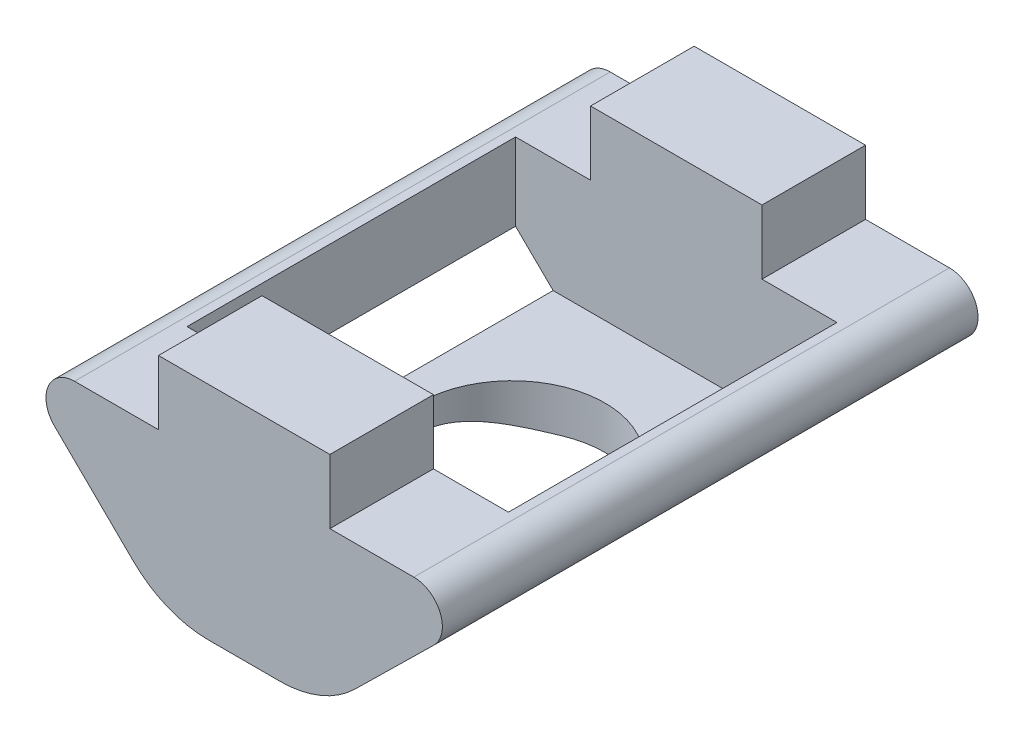
ISO-10303-21;
HEADER;
FILE_DESCRIPTION(('STEP AP214'),'2;1');
FILE_NAME('part.step','',(''),(''),'','','');
FILE_SCHEMA(('AUTOMOTIVE_DESIGN { 1 0 10303 214 1 1 1 1 }'));
ENDSEC;
DATA;
#1=APPLICATION_CONTEXT('core data for automotive mechanical design processes');
#2=APPLICATION_PROTOCOL_DEFINITION('international standard','automotive_design',2000,#1);
#3=PRODUCT_CONTEXT('',#1,'mechanical');
#4=PRODUCT('Part','Part','',(#3));
#5=PRODUCT_RELATED_PRODUCT_CATEGORY('part','',(#4));
#6=PRODUCT_DEFINITION_FORMATION('','',#4);
#7=PRODUCT_DEFINITION_CONTEXT('part definition',#1,'design');
#8=PRODUCT_DEFINITION('design','',#6,#7);
#9=PRODUCT_DEFINITION_SHAPE('','',#8);
#10=(LENGTH_UNIT() NAMED_UNIT(*) SI_UNIT(.MILLI.,.METRE.));
#11=(NAMED_UNIT(*) PLANE_ANGLE_UNIT() SI_UNIT($,.RADIAN.));
#12=(NAMED_UNIT(*) SI_UNIT($,.STERADIAN.) SOLID_ANGLE_UNIT());
#13=UNCERTAINTY_MEASURE_WITH_UNIT(LENGTH_MEASURE(1.E-05),#10,'distance_accuracy_value','');
#14=(GEOMETRIC_REPRESENTATION_CONTEXT(3) GLOBAL_UNCERTAINTY_ASSIGNED_CONTEXT((#13)) GLOBAL_UNIT_ASSIGNED_CONTEXT((#10,
#11,#12)) REPRESENTATION_CONTEXT('',''));
#15=CARTESIAN_POINT('',(0.,0.,0.));
#16=DIRECTION('',(0.,0.,1.));
#17=DIRECTION('',(1.,0.,0.));
#18=AXIS2_PLACEMENT_3D('',#15,#16,#17);
#19=CARTESIAN_POINT('',(-2.4,1.3,15.));
#20=DIRECTION('',(1.,0.,0.));
#21=DIRECTION('',(0.,0.,-1.));
#22=AXIS2_PLACEMENT_3D('',#19,#20,#21);
#23=PLANE('',#22);
#24=DIRECTION('',(0.,-1.,0.));
#25=VECTOR('',#24,1.);
#26=CARTESIAN_POINT('',(-2.4,1.3,2.9));
#27=LINE('',#26,#25);
#28=CARTESIAN_POINT('',(-2.4,3.1,2.9));
#29=VERTEX_POINT('',#28);
#30=CARTESIAN_POINT('',(-2.4,1.3,2.9));
#31=VERTEX_POINT('',#30);
#32=EDGE_CURVE('E201',#29,#31,#27,.T.);
#33=ORIENTED_EDGE('',*,*,#32,.F.);
#34=DIRECTION('',(0.,0.,-1.));
#35=VECTOR('',#34,1.);
#36=CARTESIAN_POINT('',(-2.4,3.1,15.));
#37=LINE('',#36,#35);
#38=CARTESIAN_POINT('',(-2.4,3.1,0.));
#39=VERTEX_POINT('',#38);
#40=EDGE_CURVE('E412',#29,#39,#37,.T.);
#41=ORIENTED_EDGE('',*,*,#40,.T.);
#42=DIRECTION('',(0.,-1.,0.));
#43=VECTOR('',#42,1.);
#44=CARTESIAN_POINT('',(-2.4,1.3,0.));
#45=LINE('',#44,#43);
#46=CARTESIAN_POINT('',(-2.4,1.3,0.));
#47=VERTEX_POINT('',#46);
#48=EDGE_CURVE('E413',#39,#47,#45,.T.);
#49=ORIENTED_EDGE('',*,*,#48,.T.);
#50=DIRECTION('',(0.,0.,-1.));
#51=VECTOR('',#50,1.);
#52=CARTESIAN_POINT('',(-2.4,1.3,15.));
#53=LINE('',#52,#51);
#54=EDGE_CURVE('E253',#31,#47,#53,.T.);
#55=ORIENTED_EDGE('',*,*,#54,.F.);
#56=EDGE_LOOP('',(#33,#41,#49,#55));
#57=FACE_BOUND('',#56,.T.);
#58=ADVANCED_FACE('F35',(#57),#23,.F.);
#59=CARTESIAN_POINT('',(2.4,1.3,15.));
#60=DIRECTION('',(-1.,0.,0.));
#61=DIRECTION('',(0.,-1.,0.));
#62=AXIS2_PLACEMENT_3D('',#59,#60,#61);
#63=PLANE('',#62);
#64=DIRECTION('',(0.,-1.,0.));
#65=VECTOR('',#64,1.);
#66=CARTESIAN_POINT('',(2.4,1.3,12.1));
#67=LINE('',#66,#65);
#68=CARTESIAN_POINT('',(2.4,3.1,12.1));
#69=VERTEX_POINT('',#68);
#70=CARTESIAN_POINT('',(2.4,1.3,12.1));
#71=VERTEX_POINT('',#70);
#72=EDGE_CURVE('E372',#69,#71,#67,.T.);
#73=ORIENTED_EDGE('',*,*,#72,.F.);
#74=DIRECTION('',(0.,0.,-1.));
#75=VECTOR('',#74,1.);
#76=CARTESIAN_POINT('',(2.4,3.1,15.));
#77=LINE('',#76,#75);
#78=CARTESIAN_POINT('',(2.4,3.1,15.));
#79=VERTEX_POINT('',#78);
#80=EDGE_CURVE('E221',#79,#69,#77,.T.);
#81=ORIENTED_EDGE('',*,*,#80,.F.);
#82=DIRECTION('',(0.,1.,0.));
#83=VECTOR('',#82,1.);
#84=CARTESIAN_POINT('',(2.4,1.3,15.));
#85=LINE('',#84,#83);
#86=CARTESIAN_POINT('',(2.4,1.3,15.));
#87=VERTEX_POINT('',#86);
#88=EDGE_CURVE('E409',#87,#79,#85,.T.);
#89=ORIENTED_EDGE('',*,*,#88,.F.);
#90=DIRECTION('',(0.,0.,-1.));
#91=VECTOR('',#90,1.);
#92=CARTESIAN_POINT('',(2.4,1.3,15.));
#93=LINE('',#92,#91);
#94=EDGE_CURVE('E220',#87,#71,#93,.T.);
#95=ORIENTED_EDGE('',*,*,#94,.T.);
#96=EDGE_LOOP('',(#73,#81,#89,#95));
#97=FACE_BOUND('',#96,.T.);
#98=ADVANCED_FACE('F332',(#97),#63,.F.);
#99=CARTESIAN_POINT('',(-2.4,3.1,15.));
#100=DIRECTION('',(0.,-1.,0.));
#101=DIRECTION('',(0.,0.,-1.));
#102=AXIS2_PLACEMENT_3D('',#99,#100,#101);
#103=PLANE('',#102);
#104=DIRECTION('',(1.,0.,0.));
#105=VECTOR('',#104,1.);
#106=CARTESIAN_POINT('',(4.5,3.1,12.1));
#107=LINE('',#106,#105);
#108=CARTESIAN_POINT('',(-2.4,3.1,12.1));
#109=VERTEX_POINT('',#108);
#110=EDGE_CURVE('E202',#109,#69,#107,.T.);
#111=ORIENTED_EDGE('',*,*,#110,.F.);
#112=CARTESIAN_POINT('',(-2.4,3.1,15.));
#113=VERTEX_POINT('',#112);
#114=EDGE_CURVE('E369',#113,#109,#37,.T.);
#115=ORIENTED_EDGE('',*,*,#114,.F.);
#116=DIRECTION('',(-1.,0.,0.));
#117=VECTOR('',#116,1.);
#118=CARTESIAN_POINT('',(-2.4,3.1,15.));
#119=LINE('',#118,#117);
#120=EDGE_CURVE('E388',#79,#113,#119,.T.);
#121=ORIENTED_EDGE('',*,*,#120,.F.);
#122=ORIENTED_EDGE('',*,*,#80,.T.);
#123=EDGE_LOOP('',(#111,#115,#121,#122));
#124=FACE_BOUND('',#123,.T.);
#125=ADVANCED_FACE('F328',(#124),#103,.F.);
#126=DIRECTION('',(0.,1.,0.));
#127=VECTOR('',#126,1.);
#128=CARTESIAN_POINT('',(-2.4,1.3,12.1));
#129=LINE('',#128,#127);
#130=CARTESIAN_POINT('',(-2.4,1.3,12.1));
#131=VERTEX_POINT('',#130);
#132=EDGE_CURVE('E365',#131,#109,#129,.T.);
#133=ORIENTED_EDGE('',*,*,#132,.F.);
#134=CARTESIAN_POINT('',(-2.4,1.3,15.));
#135=VERTEX_POINT('',#134);
#136=EDGE_CURVE('E42',#135,#131,#53,.T.);
#137=ORIENTED_EDGE('',*,*,#136,.F.);
#138=DIRECTION('',(0.,-1.,0.));
#139=VECTOR('',#138,1.);
#140=CARTESIAN_POINT('',(-2.4,1.3,15.));
#141=LINE('',#140,#139);
#142=EDGE_CURVE('E385',#113,#135,#141,.T.);
#143=ORIENTED_EDGE('',*,*,#142,.F.);
#144=ORIENTED_EDGE('',*,*,#114,.T.);
#145=EDGE_LOOP('',(#133,#137,#143,#144));
#146=FACE_BOUND('',#145,.T.);
#147=ADVANCED_FACE('F331',(#146),#23,.F.);
#148=DIRECTION('',(0.,1.,0.));
#149=VECTOR('',#148,1.);
#150=CARTESIAN_POINT('',(2.4,1.3,2.9));
#151=LINE('',#150,#149);
#152=CARTESIAN_POINT('',(2.4,1.3,2.9));
#153=VERTEX_POINT('',#152);
#154=CARTESIAN_POINT('',(2.4,3.1,2.9));
#155=VERTEX_POINT('',#154);
#156=EDGE_CURVE('E192',#153,#155,#151,.T.);
#157=ORIENTED_EDGE('',*,*,#156,.F.);
#158=CARTESIAN_POINT('',(2.4,1.3,0.));
#159=VERTEX_POINT('',#158);
#160=EDGE_CURVE('E197',#153,#159,#93,.T.);
#161=ORIENTED_EDGE('',*,*,#160,.T.);
#162=DIRECTION('',(0.,1.,0.));
#163=VECTOR('',#162,1.);
#164=CARTESIAN_POINT('',(2.4,1.3,0.));
#165=LINE('',#164,#163);
#166=CARTESIAN_POINT('',(2.4,3.1,0.));
#167=VERTEX_POINT('',#166);
#168=EDGE_CURVE('E391',#159,#167,#165,.T.);
#169=ORIENTED_EDGE('',*,*,#168,.T.);
#170=EDGE_CURVE('E199',#155,#167,#77,.T.);
#171=ORIENTED_EDGE('',*,*,#170,.F.);
#172=EDGE_LOOP('',(#157,#161,#169,#171));
#173=FACE_BOUND('',#172,.T.);
#174=ADVANCED_FACE('F194',(#173),#63,.F.);
#175=DIRECTION('',(-1.,0.,0.));
#176=VECTOR('',#175,1.);
#177=CARTESIAN_POINT('',(4.5,3.1,2.9));
#178=LINE('',#177,#176);
#179=EDGE_CURVE('E475',#155,#29,#178,.T.);
#180=ORIENTED_EDGE('',*,*,#179,.F.);
#181=ORIENTED_EDGE('',*,*,#170,.T.);
#182=DIRECTION('',(-1.,0.,0.));
#183=VECTOR('',#182,1.);
#184=CARTESIAN_POINT('',(-2.4,3.1,0.));
#185=LINE('',#184,#183);
#186=EDGE_CURVE('E389',#167,#39,#185,.T.);
#187=ORIENTED_EDGE('',*,*,#186,.T.);
#188=ORIENTED_EDGE('',*,*,#40,.F.);
#189=EDGE_LOOP('',(#180,#181,#187,#188));
#190=FACE_BOUND('',#189,.T.);
#191=ADVANCED_FACE('F334',(#190),#103,.F.);
#192=CARTESIAN_POINT('',(-4.75,1.3,15.));
#193=DIRECTION('',(0.,-1.,0.));
#194=DIRECTION('',(0.,0.,-1.));
#195=AXIS2_PLACEMENT_3D('',#192,#193,#194);
#196=PLANE('',#195);
#197=DIRECTION('',(-1.,0.,0.));
#198=VECTOR('',#197,1.);
#199=CARTESIAN_POINT('',(-4.5,1.3,12.1));
#200=LINE('',#199,#198);
#201=CARTESIAN_POINT('',(-4.5,1.3,12.1));
#202=VERTEX_POINT('',#201);
#203=EDGE_CURVE('E374',#131,#202,#200,.T.);
#204=ORIENTED_EDGE('',*,*,#203,.T.);
#205=DIRECTION('',(0.,0.,-1.));
#206=VECTOR('',#205,1.);
#207=CARTESIAN_POINT('',(-4.5,1.3,12.1));
#208=LINE('',#207,#206);
#209=CARTESIAN_POINT('',(-4.5,1.3,2.9));
#210=VERTEX_POINT('',#209);
#211=EDGE_CURVE('E258',#202,#210,#208,.T.);
#212=ORIENTED_EDGE('',*,*,#211,.T.);
#213=DIRECTION('',(-1.,0.,0.));
#214=VECTOR('',#213,1.);
#215=CARTESIAN_POINT('',(-4.5,1.3,2.9));
#216=LINE('',#215,#214);
#217=EDGE_CURVE('E212',#31,#210,#216,.T.);
#218=ORIENTED_EDGE('',*,*,#217,.F.);
#219=ORIENTED_EDGE('',*,*,#54,.T.);
#220=DIRECTION('',(-1.,0.,0.));
#221=VECTOR('',#220,1.);
#222=CARTESIAN_POINT('',(-4.75,1.3,0.));
#223=LINE('',#222,#221);
#224=CARTESIAN_POINT('',(-4.75,1.3,0.));
#225=VERTEX_POINT('',#224);
#226=EDGE_CURVE('E416',#47,#225,#223,.T.);
#227=ORIENTED_EDGE('',*,*,#226,.T.);
#228=DIRECTION('',(0.,0.,-1.));
#229=VECTOR('',#228,1.);
#230=CARTESIAN_POINT('',(-4.75,1.3,15.));
#231=LINE('',#230,#229);
#232=CARTESIAN_POINT('',(-4.75,1.3,15.));
#233=VERTEX_POINT('',#232);
#234=EDGE_CURVE('E250',#233,#225,#231,.T.);
#235=ORIENTED_EDGE('',*,*,#234,.F.);
#236=DIRECTION('',(-1.,0.,0.));
#237=VECTOR('',#236,1.);
#238=CARTESIAN_POINT('',(-4.75,1.3,15.));
#239=LINE('',#238,#237);
#240=EDGE_CURVE('E381',#135,#233,#239,.T.);
#241=ORIENTED_EDGE('',*,*,#240,.F.);
#242=ORIENTED_EDGE('',*,*,#136,.T.);
#243=EDGE_LOOP('',(#204,#212,#218,#219,#227,#235,#241,#242));
#244=FACE_BOUND('',#243,.T.);
#245=ADVANCED_FACE('F349',(#244),#196,.F.);
#246=CARTESIAN_POINT('',(-5.31064270705133,-0.0706835857374572,15.));
#247=DIRECTION('',(0.700803383814158,0.713354482171821,0.));
#248=DIRECTION('',(-0.713354482171821,0.700803383814158,0.));
#249=AXIS2_PLACEMENT_3D('',#246,#247,#248);
#250=PLANE('',#249);
#251=DIRECTION('',(0.713354482171821,-0.700803383814158,0.));
#252=VECTOR('',#251,1.);
#253=CARTESIAN_POINT('',(-5.31064270705133,-0.0706835857374572,0.));
#254=LINE('',#253,#252);
#255=CARTESIAN_POINT('',(-5.31064270705133,-0.0706835857374571,0.));
#256=VERTEX_POINT('',#255);
#257=CARTESIAN_POINT('',(-3.10241015144247,-2.24006344651546,0.));
#258=VERTEX_POINT('',#257);
#259=EDGE_CURVE('E420',#256,#258,#254,.T.);
#260=ORIENTED_EDGE('',*,*,#259,.T.);
#261=DIRECTION('',(0.,0.,-1.));
#262=VECTOR('',#261,1.);
#263=CARTESIAN_POINT('',(-3.10241015144247,-2.24006344651546,15.));
#264=LINE('',#263,#262);
#265=CARTESIAN_POINT('',(-3.10241015144247,-2.24006344651546,15.));
#266=VERTEX_POINT('',#265);
#267=EDGE_CURVE('E244',#266,#258,#264,.T.);
#268=ORIENTED_EDGE('',*,*,#267,.F.);
#269=DIRECTION('',(0.713354482171821,-0.700803383814158,0.));
#270=VECTOR('',#269,1.);
#271=CARTESIAN_POINT('',(-5.31064270705133,-0.0706835857374572,15.));
#272=LINE('',#271,#270);
#273=CARTESIAN_POINT('',(-5.31064270705133,-0.0706835857374571,15.));
#274=VERTEX_POINT('',#273);
#275=EDGE_CURVE('E395',#274,#266,#272,.T.);
#276=ORIENTED_EDGE('',*,*,#275,.F.);
#277=DIRECTION('',(0.,0.,-1.));
#278=VECTOR('',#277,1.);
#279=CARTESIAN_POINT('',(-5.31064270705133,-0.0706835857374571,15.));
#280=LINE('',#279,#278);
#281=EDGE_CURVE('E247',#274,#256,#280,.T.);
#282=ORIENTED_EDGE('',*,*,#281,.T.);
#283=EDGE_LOOP('',(#260,#268,#276,#282));
#284=FACE_BOUND('',#283,.T.);
#285=DIRECTION('',(-0.713354482171821,0.700803383814158,0.));
#286=VECTOR('',#285,1.);
#287=CARTESIAN_POINT('',(-5.31064270705133,-0.0706835857374572,12.1));
#288=LINE('',#287,#286);
#289=CARTESIAN_POINT('',(-3.44856399344352,-1.9,12.1));
#290=VERTEX_POINT('',#289);
#291=CARTESIAN_POINT('',(-4.5,-0.867063459087724,12.1));
#292=VERTEX_POINT('',#291);
#293=EDGE_CURVE('E283',#290,#292,#288,.T.);
#294=ORIENTED_EDGE('',*,*,#293,.F.);
#295=DIRECTION('',(0.,0.,1.));
#296=VECTOR('',#295,1.);
#297=CARTESIAN_POINT('',(-3.44856399344352,-1.9,15.));
#298=LINE('',#297,#296);
#299=CARTESIAN_POINT('',(-3.44856399344352,-1.9,2.9));
#300=VERTEX_POINT('',#299);
#301=EDGE_CURVE('E261',#300,#290,#298,.T.);
#302=ORIENTED_EDGE('',*,*,#301,.F.);
#303=DIRECTION('',(-0.713354482171821,0.700803383814158,0.));
#304=VECTOR('',#303,1.);
#305=CARTESIAN_POINT('',(-5.31064270705133,-0.0706835857374572,2.9));
#306=LINE('',#305,#304);
#307=CARTESIAN_POINT('',(-4.5,-0.867063459087724,2.9));
#308=VERTEX_POINT('',#307);
#309=EDGE_CURVE('E278',#300,#308,#306,.T.);
#310=ORIENTED_EDGE('',*,*,#309,.T.);
#311=DIRECTION('',(0.,0.,-1.));
#312=VECTOR('',#311,1.);
#313=CARTESIAN_POINT('',(-4.5,-0.867063459087724,15.));
#314=LINE('',#313,#312);
#315=EDGE_CURVE('E11',#292,#308,#314,.T.);
#316=ORIENTED_EDGE('',*,*,#315,.F.);
#317=EDGE_LOOP('',(#294,#302,#310,#316));
#318=FACE_BOUND('',#317,.T.);
#319=ADVANCED_FACE('F344',(#284,#318),#250,.F.);
#320=CARTESIAN_POINT('',(5.31064270705133,-0.0706835857374559,15.));
#321=DIRECTION('',(-0.700803383814158,0.71335448217182,0.));
#322=DIRECTION('',(-0.71335448217182,-0.700803383814158,0.));
#323=AXIS2_PLACEMENT_3D('',#320,#321,#322);
#324=PLANE('',#323);
#325=DIRECTION('',(0.71335448217182,0.700803383814158,0.));
#326=VECTOR('',#325,1.);
#327=CARTESIAN_POINT('',(5.31064270705133,-0.0706835857374559,0.));
#328=LINE('',#327,#326);
#329=CARTESIAN_POINT('',(3.10241015144247,-2.24006344651546,0.));
#330=VERTEX_POINT('',#329);
#331=CARTESIAN_POINT('',(5.31064270705133,-0.0706835857374559,0.));
#332=VERTEX_POINT('',#331);
#333=EDGE_CURVE('E430',#330,#332,#328,.T.);
#334=ORIENTED_EDGE('',*,*,#333,.T.);
#335=DIRECTION('',(0.,0.,-1.));
#336=VECTOR('',#335,1.);
#337=CARTESIAN_POINT('',(5.31064270705133,-0.0706835857374559,15.));
#338=LINE('',#337,#336);
#339=CARTESIAN_POINT('',(5.31064270705133,-0.0706835857374559,15.));
#340=VERTEX_POINT('',#339);
#341=EDGE_CURVE('E230',#340,#332,#338,.T.);
#342=ORIENTED_EDGE('',*,*,#341,.F.);
#343=DIRECTION('',(0.71335448217182,0.700803383814158,0.));
#344=VECTOR('',#343,1.);
#345=CARTESIAN_POINT('',(5.31064270705133,-0.0706835857374559,15.));
#346=LINE('',#345,#344);
#347=CARTESIAN_POINT('',(3.10241015144247,-2.24006344651546,15.));
#348=VERTEX_POINT('',#347);
#349=EDGE_CURVE('E403',#348,#340,#346,.T.);
#350=ORIENTED_EDGE('',*,*,#349,.F.);
#351=DIRECTION('',(0.,0.,-1.));
#352=VECTOR('',#351,1.);
#353=CARTESIAN_POINT('',(3.10241015144247,-2.24006344651546,15.));
#354=LINE('',#353,#352);
#355=EDGE_CURVE('E233',#348,#330,#354,.T.);
#356=ORIENTED_EDGE('',*,*,#355,.T.);
#357=EDGE_LOOP('',(#334,#342,#350,#356));
#358=FACE_BOUND('',#357,.T.);
#359=DIRECTION('',(-0.71335448217182,-0.700803383814158,0.));
#360=VECTOR('',#359,1.);
#361=CARTESIAN_POINT('',(5.31064270705133,-0.0706835857374559,12.1));
#362=LINE('',#361,#360);
#363=CARTESIAN_POINT('',(4.5,-0.867063459087723,12.1));
#364=VERTEX_POINT('',#363);
#365=CARTESIAN_POINT('',(3.44856399344351,-1.9,12.1));
#366=VERTEX_POINT('',#365);
#367=EDGE_CURVE('E281',#364,#366,#362,.T.);
#368=ORIENTED_EDGE('',*,*,#367,.F.);
#369=DIRECTION('',(0.,0.,1.));
#370=VECTOR('',#369,1.);
#371=CARTESIAN_POINT('',(4.5,-0.867063459087724,15.));
#372=LINE('',#371,#370);
#373=CARTESIAN_POINT('',(4.5,-0.867063459087723,2.9));
#374=VERTEX_POINT('',#373);
#375=EDGE_CURVE('E285',#374,#364,#372,.T.);
#376=ORIENTED_EDGE('',*,*,#375,.F.);
#377=DIRECTION('',(-0.71335448217182,-0.700803383814158,0.));
#378=VECTOR('',#377,1.);
#379=CARTESIAN_POINT('',(5.31064270705133,-0.0706835857374559,2.9));
#380=LINE('',#379,#378);
#381=CARTESIAN_POINT('',(3.44856399344352,-1.9,2.9));
#382=VERTEX_POINT('',#381);
#383=EDGE_CURVE('E275',#374,#382,#380,.T.);
#384=ORIENTED_EDGE('',*,*,#383,.T.);
#385=DIRECTION('',(0.,0.,-1.));
#386=VECTOR('',#385,1.);
#387=CARTESIAN_POINT('',(3.44856399344352,-1.9,15.));
#388=LINE('',#387,#386);
#389=EDGE_CURVE('E257',#366,#382,#388,.T.);
#390=ORIENTED_EDGE('',*,*,#389,.F.);
#391=EDGE_LOOP('',(#368,#376,#384,#390));
#392=FACE_BOUND('',#391,.T.);
#393=ADVANCED_FACE('F340',(#358,#392),#324,.F.);
#394=CARTESIAN_POINT('',(4.75,1.3,15.));
#395=DIRECTION('',(0.,-1.,0.));
#396=DIRECTION('',(1.,0.,0.));
#397=AXIS2_PLACEMENT_3D('',#394,#395,#396);
#398=PLANE('',#397);
#399=CARTESIAN_POINT('',(4.5,1.3,12.1));
#400=VERTEX_POINT('',#399);
#401=EDGE_CURVE('E378',#400,#71,#200,.T.);
#402=ORIENTED_EDGE('',*,*,#401,.T.);
#403=ORIENTED_EDGE('',*,*,#94,.F.);
#404=DIRECTION('',(-1.,0.,0.));
#405=VECTOR('',#404,1.);
#406=CARTESIAN_POINT('',(4.75,1.3,15.));
#407=LINE('',#406,#405);
#408=CARTESIAN_POINT('',(4.75,1.3,15.));
#409=VERTEX_POINT('',#408);
#410=EDGE_CURVE('E407',#409,#87,#407,.T.);
#411=ORIENTED_EDGE('',*,*,#410,.F.);
#412=DIRECTION('',(0.,0.,-1.));
#413=VECTOR('',#412,1.);
#414=CARTESIAN_POINT('',(4.75,1.3,15.));
#415=LINE('',#414,#413);
#416=CARTESIAN_POINT('',(4.75,1.3,0.));
#417=VERTEX_POINT('',#416);
#418=EDGE_CURVE('E224',#409,#417,#415,.T.);
#419=ORIENTED_EDGE('',*,*,#418,.T.);
#420=DIRECTION('',(-1.,0.,0.));
#421=VECTOR('',#420,1.);
#422=CARTESIAN_POINT('',(4.75,1.3,0.));
#423=LINE('',#422,#421);
#424=EDGE_CURVE('E218',#417,#159,#423,.T.);
#425=ORIENTED_EDGE('',*,*,#424,.T.);
#426=ORIENTED_EDGE('',*,*,#160,.F.);
#427=CARTESIAN_POINT('',(4.5,1.3,2.9));
#428=VERTEX_POINT('',#427);
#429=EDGE_CURVE('E205',#428,#153,#216,.T.);
#430=ORIENTED_EDGE('',*,*,#429,.F.);
#431=DIRECTION('',(0.,0.,-1.));
#432=VECTOR('',#431,1.);
#433=CARTESIAN_POINT('',(4.5,1.3,12.1));
#434=LINE('',#433,#432);
#435=EDGE_CURVE('E264',#400,#428,#434,.T.);
#436=ORIENTED_EDGE('',*,*,#435,.F.);
#437=EDGE_LOOP('',(#402,#403,#411,#419,#425,#426,#430,#436));
#438=FACE_BOUND('',#437,.T.);
#439=ADVANCED_FACE('F215',(#438),#398,.F.);
#440=CARTESIAN_POINT('',(0.,-3.1,7.5));
#441=DIRECTION('',(0.,1.,0.));
#442=DIRECTION('',(0.,0.,1.));
#443=AXIS2_PLACEMENT_3D('',#440,#441,#442);
#444=CYLINDRICAL_SURFACE('',#443,2.6);
#445=CARTESIAN_POINT('',(0.,-3.1,7.5));
#446=DIRECTION('',(0.,1.,0.));
#447=DIRECTION('',(0.,0.,1.));
#448=AXIS2_PLACEMENT_3D('',#445,#446,#447);
#449=CIRCLE('',#448,2.6);
#450=CARTESIAN_POINT('',(1.,-3.1,5.1));
#451=VERTEX_POINT('',#450);
#452=CARTESIAN_POINT('',(-0.999999999999999,-3.1,5.1));
#453=VERTEX_POINT('',#452);
#454=EDGE_CURVE('E290',#451,#453,#449,.T.);
#455=ORIENTED_EDGE('',*,*,#454,.F.);
#456=CARTESIAN_POINT('',(1.,-3.1,9.9));
#457=CARTESIAN_POINT('',(1.0632029540947,-3.10001116285806,9.87368005688211));
#458=CARTESIAN_POINT('',(1.12532502498136,-3.09800334228728,9.84485232216623));
#459=CARTESIAN_POINT('',(1.24687292396521,-3.09044125850987,9.78253105734364));
#460=CARTESIAN_POINT('',(1.306301774071,-3.08489108121563,9.74904293748678));
#461=CARTESIAN_POINT('',(1.42167144369659,-3.07078311101163,9.67793823217298));
#462=CARTESIAN_POINT('',(1.47763375701159,-3.06224663128394,9.64035216888479));
#463=CARTESIAN_POINT('',(1.58619695510047,-3.04268894992389,9.56118818788518));
#464=CARTESIAN_POINT('',(1.63879691481219,-3.03166706824338,9.51960917942726));
#465=CARTESIAN_POINT('',(1.79070322526787,-2.99578384493525,9.38972468913279));
#466=CARTESIAN_POINT('',(1.88470253020998,-2.96802303249322,9.29590734110628));
#467=CARTESIAN_POINT('',(2.05710672624906,-2.90906926805416,9.0955731718003));
#468=CARTESIAN_POINT('',(2.13547105897998,-2.87786770749057,8.98902443902798));
#469=CARTESIAN_POINT('',(2.28302175236306,-2.81312131842722,8.75271456889041));
#470=CARTESIAN_POINT('',(2.35025025810281,-2.77969628124121,8.62168930728834));
#471=CARTESIAN_POINT('',(2.46199993240625,-2.72042152184172,8.34865287937226));
#472=CARTESIAN_POINT('',(2.50654977981215,-2.69456224985459,8.20665585085295));
#473=CARTESIAN_POINT('',(2.55435132769382,-2.66598981701034,7.99046468482916));
#474=CARTESIAN_POINT('',(2.56706080947152,-2.65821114628701,7.91892751381583));
#475=CARTESIAN_POINT('',(2.58646203795738,-2.64622747639563,7.77475993133218));
#476=CARTESIAN_POINT('',(2.59315696792441,-2.64202058689317,7.70213011887358));
#477=CARTESIAN_POINT('',(2.60040850115191,-2.63746163024117,7.55647715071615));
#478=CARTESIAN_POINT('',(2.60096806959207,-2.637107700982,7.48345420209172));
#479=CARTESIAN_POINT('',(2.59595634584064,-2.64026113434727,7.33772572323663));
#480=CARTESIAN_POINT('',(2.59038556657751,-2.64376817392304,7.26502016696062));
#481=CARTESIAN_POINT('',(2.56698560591464,-2.65829895205072,7.0684637659875));
#482=CARTESIAN_POINT('',(2.54321406470009,-2.67291911091987,6.94553213317575));
#483=CARTESIAN_POINT('',(2.47879073387579,-2.71046655500755,6.70559134840233));
#484=CARTESIAN_POINT('',(2.43812975458518,-2.73339836179466,6.5885854596307));
#485=CARTESIAN_POINT('',(2.33752491725279,-2.78597719229602,6.35393904790788));
#486=CARTESIAN_POINT('',(2.27636779794472,-2.81599781197006,6.23690366686659));
#487=CARTESIAN_POINT('',(2.13721684397896,-2.87714420416498,6.01350168630253));
#488=CARTESIAN_POINT('',(2.05920144423105,-2.90827134914053,5.90714900973498));
#489=CARTESIAN_POINT('',(1.87570019235541,-2.97119124566875,5.69331444649647));
#490=CARTESIAN_POINT('',(1.76792955305578,-3.00250883802965,5.58761027990754));
#491=CARTESIAN_POINT('',(1.59290948665908,-3.04143457991773,5.4437052165573));
#492=CARTESIAN_POINT('',(1.53240510660841,-3.05306090939839,5.39821454867091));
#493=CARTESIAN_POINT('',(1.40728592900356,-3.07289730635579,5.31247121278586));
#494=CARTESIAN_POINT('',(1.34267449457707,-3.08111012852688,5.27221433922584));
#495=CARTESIAN_POINT('',(1.23170667460787,-3.09137384756358,5.20969022938749));
#496=CARTESIAN_POINT('',(1.18632775789474,-3.09456273246429,5.18585826696424));
#497=CARTESIAN_POINT('',(1.0941671429926,-3.09887723303298,5.14088344716024));
#498=CARTESIAN_POINT('',(1.04738555573553,-3.10000301142913,5.11974037781461));
#499=CARTESIAN_POINT('',(1.,-3.1,5.1));
#500=B_SPLINE_CURVE_WITH_KNOTS('',3,(#456,#457,#458,#459,#460,#461,#462,#463,#464,#465,#466,
#467,#468,#469,#470,#471,#472,#473,#474,#475,#476,#477,#478,#479,#480,#481,#482,#483,#484,#485,
#486,#487,#488,#489,#490,#491,#492,#493,#494,#495,#496,#497,#498,#499),.UNSPECIFIED.,.F.,.F.,(4,
2,2,2,2,2,2,2,2,2,2,2,2,2,2,2,2,2,2,2,2,4),(0.,0.20525956481019,0.410282800893781,
0.613871677454855,0.817516327124767,1.22274490089169,1.62901137990442,2.07996824128103,
2.53035340881014,2.74928321160855,2.96809707534219,3.18680518311734,3.40549499289579,
3.78185867204701,4.15842740255099,4.56311789605655,4.96832916645092,5.42812463499898,
5.65759231809032,5.88687445992313,6.04081953845399,6.19475247399517),.UNSPECIFIED.);
#501=CARTESIAN_POINT('',(1.,-3.1,9.9));
#502=VERTEX_POINT('',#501);
#503=EDGE_CURVE('E291',#502,#451,#500,.T.);
#504=ORIENTED_EDGE('',*,*,#503,.F.);
#505=CARTESIAN_POINT('',(-0.999999999999999,-3.1,9.9));
#506=VERTEX_POINT('',#505);
#507=EDGE_CURVE('E287',#506,#502,#449,.T.);
#508=ORIENTED_EDGE('',*,*,#507,.F.);
#509=CARTESIAN_POINT('',(-0.999999999999999,-3.1,5.1));
#510=CARTESIAN_POINT('',(-1.0632029540947,-3.10001116285807,5.12631994311789));
#511=CARTESIAN_POINT('',(-1.12532502498136,-3.09800334228729,5.15514767783377));
#512=CARTESIAN_POINT('',(-1.24687292396521,-3.09044125850987,5.21746894265636));
#513=CARTESIAN_POINT('',(-1.30630177407099,-3.08489108121564,5.25095706251322));
#514=CARTESIAN_POINT('',(-1.42167144369659,-3.07078311101164,5.32206176782701));
#515=CARTESIAN_POINT('',(-1.47763375701158,-3.06224663128395,5.3596478311152));
#516=CARTESIAN_POINT('',(-1.58619695510047,-3.04268894992389,5.43881181211482));
#517=CARTESIAN_POINT('',(-1.63879691481219,-3.03166706824338,5.48039082057274));
#518=CARTESIAN_POINT('',(-1.79070322526786,-2.99578384493525,5.61027531086721));
#519=CARTESIAN_POINT('',(-1.88470253020998,-2.96802303249323,5.70409265889371));
#520=CARTESIAN_POINT('',(-2.05710672624905,-2.90906926805417,5.9044268281997));
#521=CARTESIAN_POINT('',(-2.13547105897998,-2.87786770749057,6.01097556097201));
#522=CARTESIAN_POINT('',(-2.28302175236306,-2.81312131842722,6.24728543110959));
#523=CARTESIAN_POINT('',(-2.35025025810281,-2.77969628124122,6.37831069271166));
#524=CARTESIAN_POINT('',(-2.46199993240625,-2.72042152184173,6.65134712062773));
#525=CARTESIAN_POINT('',(-2.50654977981215,-2.69456224985459,6.79334414914704));
#526=CARTESIAN_POINT('',(-2.55435132769382,-2.66598981701034,7.00953531517084));
#527=CARTESIAN_POINT('',(-2.56706080947152,-2.65821114628701,7.08107248618416));
#528=CARTESIAN_POINT('',(-2.58646203795738,-2.64622747639564,7.22524006866781));
#529=CARTESIAN_POINT('',(-2.5931569679244,-2.64202058689317,7.29786988112641));
#530=CARTESIAN_POINT('',(-2.60040850115191,-2.63746163024117,7.44352284928384));
#531=CARTESIAN_POINT('',(-2.60096806959207,-2.637107700982,7.51654579790827));
#532=CARTESIAN_POINT('',(-2.59595634584064,-2.64026113434727,7.66227427676336));
#533=CARTESIAN_POINT('',(-2.59038556657751,-2.64376817392304,7.73497983303938));
#534=CARTESIAN_POINT('',(-2.56698560591464,-2.65829895205072,7.93153623401249));
#535=CARTESIAN_POINT('',(-2.54321406470009,-2.67291911091987,8.05446786682425));
#536=CARTESIAN_POINT('',(-2.47879073387579,-2.71046655500755,8.29440865159767));
#537=CARTESIAN_POINT('',(-2.43812975458518,-2.73339836179466,8.4114145403693));
#538=CARTESIAN_POINT('',(-2.33752491725279,-2.78597719229603,8.64606095209212));
#539=CARTESIAN_POINT('',(-2.27636779794472,-2.81599781197006,8.76309633313341));
#540=CARTESIAN_POINT('',(-2.13721684397896,-2.87714420416498,8.98649831369747));
#541=CARTESIAN_POINT('',(-2.05920144423105,-2.90827134914053,9.09285099026501));
#542=CARTESIAN_POINT('',(-1.87570019235541,-2.97119124566875,9.30668555350353));
#543=CARTESIAN_POINT('',(-1.76792955305578,-3.00250883802965,9.41238972009246));
#544=CARTESIAN_POINT('',(-1.59290948665908,-3.04143457991773,9.5562947834427));
#545=CARTESIAN_POINT('',(-1.53240510660841,-3.05306090939839,9.60178545132909));
#546=CARTESIAN_POINT('',(-1.40728592900356,-3.07289730635579,9.68752878721414));
#547=CARTESIAN_POINT('',(-1.34267449457707,-3.08111012852688,9.72778566077415));
#548=CARTESIAN_POINT('',(-1.23170667460787,-3.09137384756358,9.79030977061251));
#549=CARTESIAN_POINT('',(-1.18632775789474,-3.09456273246429,9.81414173303576));
#550=CARTESIAN_POINT('',(-1.09416714299259,-3.09887723303298,9.85911655283976));
#551=CARTESIAN_POINT('',(-1.04738555573553,-3.10000301142913,9.88025962218539));
#552=CARTESIAN_POINT('',(-0.999999999999998,-3.1,9.9));
#553=B_SPLINE_CURVE_WITH_KNOTS('',3,(#509,#510,#511,#512,#513,#514,#515,#516,#517,#518,#519,
#520,#521,#522,#523,#524,#525,#526,#527,#528,#529,#530,#531,#532,#533,#534,#535,#536,#537,#538,
#539,#540,#541,#542,#543,#544,#545,#546,#547,#548,#549,#550,#551,#552),.UNSPECIFIED.,.F.,.F.,(4,
2,2,2,2,2,2,2,2,2,2,2,2,2,2,2,2,2,2,2,2,4),(0.,0.20525956481019,0.410282800893781,
0.613871677454855,0.817516327124767,1.22274490089169,1.62901137990442,2.07996824128103,
2.53035340881014,2.74928321160855,2.96809707534218,3.18680518311734,3.40549499289579,
3.78185867204701,4.15842740255099,4.56311789605655,4.96832916645092,5.42812463499898,
5.65759231809032,5.88687445992313,6.040819538454,6.19475247399518),.UNSPECIFIED.);
#554=EDGE_CURVE('E299',#453,#506,#553,.T.);
#555=ORIENTED_EDGE('',*,*,#554,.F.);
#556=EDGE_LOOP('',(#455,#504,#508,#555));
#557=FACE_BOUND('',#556,.T.);
#558=CARTESIAN_POINT('',(0.,-1.9,7.5));
#559=DIRECTION('',(0.,1.,0.));
#560=DIRECTION('',(-1.,0.,0.));
#561=AXIS2_PLACEMENT_3D('',#558,#559,#560);
#562=CIRCLE('',#561,2.6);
#563=CARTESIAN_POINT('',(-2.6,-1.9,7.5));
#564=VERTEX_POINT('',#563);
#565=EDGE_CURVE('E255',#564,#564,#562,.F.);
#566=ORIENTED_EDGE('',*,*,#565,.F.);
#567=EDGE_LOOP('',(#566));
#568=FACE_BOUND('',#567,.T.);
#569=ADVANCED_FACE('F309',(#557,#568),#444,.F.);
#570=CARTESIAN_POINT('',(-0.999999999999999,-3.1,15.));
#571=DIRECTION('',(0.,1.,0.));
#572=DIRECTION('',(-1.,0.,0.));
#573=AXIS2_PLACEMENT_3D('',#570,#571,#572);
#574=PLANE('',#573);
#575=DIRECTION('',(0.,0.,-1.));
#576=VECTOR('',#575,1.);
#577=CARTESIAN_POINT('',(-0.999999999999999,-3.1,15.));
#578=LINE('',#577,#576);
#579=CARTESIAN_POINT('',(-0.999999999999999,-3.1,15.));
#580=VERTEX_POINT('',#579);
#581=EDGE_CURVE('E241',#580,#506,#578,.T.);
#582=ORIENTED_EDGE('',*,*,#581,.T.);
#583=ORIENTED_EDGE('',*,*,#507,.T.);
#584=DIRECTION('',(0.,0.,-1.));
#585=VECTOR('',#584,1.);
#586=CARTESIAN_POINT('',(1.,-3.1,15.));
#587=LINE('',#586,#585);
#588=CARTESIAN_POINT('',(1.,-3.1,15.));
#589=VERTEX_POINT('',#588);
#590=EDGE_CURVE('E237',#589,#502,#587,.T.);
#591=ORIENTED_EDGE('',*,*,#590,.F.);
#592=DIRECTION('',(1.,0.,0.));
#593=VECTOR('',#592,1.);
#594=CARTESIAN_POINT('',(-0.999999999999999,-3.1,15.));
#595=LINE('',#594,#593);
#596=EDGE_CURVE('E399',#580,#589,#595,.T.);
#597=ORIENTED_EDGE('',*,*,#596,.F.);
#598=EDGE_LOOP('',(#582,#583,#591,#597));
#599=FACE_BOUND('',#598,.T.);
#600=ADVANCED_FACE('F314',(#599),#574,.F.);
#601=CARTESIAN_POINT('',(-4.75,0.5,15.));
#602=DIRECTION('',(0.,0.,-1.));
#603=DIRECTION('',(-1.,0.,0.));
#604=AXIS2_PLACEMENT_3D('',#601,#602,#603);
#605=CYLINDRICAL_SURFACE('',#604,0.800000000000001);
#606=CARTESIAN_POINT('',(-4.75,0.5,0.));
#607=DIRECTION('',(0.,0.,1.));
#608=DIRECTION('',(-1.,0.,0.));
#609=AXIS2_PLACEMENT_3D('',#606,#607,#608);
#610=CIRCLE('',#609,0.800000000000001);
#611=EDGE_CURVE('E418',#225,#256,#610,.T.);
#612=ORIENTED_EDGE('',*,*,#611,.T.);
#613=ORIENTED_EDGE('',*,*,#281,.F.);
#614=CARTESIAN_POINT('',(-4.75,0.5,15.));
#615=DIRECTION('',(0.,0.,1.));
#616=DIRECTION('',(-1.,0.,0.));
#617=AXIS2_PLACEMENT_3D('',#614,#615,#616);
#618=CIRCLE('',#617,0.800000000000001);
#619=EDGE_CURVE('E384',#233,#274,#618,.T.);
#620=ORIENTED_EDGE('',*,*,#619,.F.);
#621=ORIENTED_EDGE('',*,*,#234,.T.);
#622=EDGE_LOOP('',(#612,#613,#620,#621));
#623=FACE_BOUND('',#622,.T.);
#624=ADVANCED_FACE('F444',(#623),#605,.T.);
#625=CARTESIAN_POINT('',(-0.999999999999999,-0.0999999999999998,15.));
#626=DIRECTION('',(0.,0.,-1.));
#627=DIRECTION('',(-1.,0.,0.));
#628=AXIS2_PLACEMENT_3D('',#625,#626,#627);
#629=CYLINDRICAL_SURFACE('',#628,3.);
#630=CARTESIAN_POINT('',(-0.999999999999999,-3.1,0.));
#631=VERTEX_POINT('',#630);
#632=EDGE_CURVE('E240',#453,#631,#578,.T.);
#633=ORIENTED_EDGE('',*,*,#632,.F.);
#634=ORIENTED_EDGE('',*,*,#554,.T.);
#635=ORIENTED_EDGE('',*,*,#581,.F.);
#636=CARTESIAN_POINT('',(-0.999999999999999,-0.0999999999999998,15.));
#637=DIRECTION('',(0.,0.,1.));
#638=DIRECTION('',(-1.,0.,0.));
#639=AXIS2_PLACEMENT_3D('',#636,#637,#638);
#640=CIRCLE('',#639,3.);
#641=EDGE_CURVE('E397',#266,#580,#640,.T.);
#642=ORIENTED_EDGE('',*,*,#641,.F.);
#643=ORIENTED_EDGE('',*,*,#267,.T.);
#644=CARTESIAN_POINT('',(-0.999999999999999,-0.0999999999999998,0.));
#645=DIRECTION('',(0.,0.,1.));
#646=DIRECTION('',(-1.,0.,0.));
#647=AXIS2_PLACEMENT_3D('',#644,#645,#646);
#648=CIRCLE('',#647,3.);
#649=EDGE_CURVE('E422',#258,#631,#648,.T.);
#650=ORIENTED_EDGE('',*,*,#649,.T.);
#651=EDGE_LOOP('',(#633,#634,#635,#642,#643,#650));
#652=FACE_BOUND('',#651,.T.);
#653=ADVANCED_FACE('F454',(#652),#629,.T.);
#654=CARTESIAN_POINT('',(1.,-3.1,0.));
#655=VERTEX_POINT('',#654);
#656=EDGE_CURVE('E236',#451,#655,#587,.T.);
#657=ORIENTED_EDGE('',*,*,#656,.F.);
#658=ORIENTED_EDGE('',*,*,#454,.T.);
#659=ORIENTED_EDGE('',*,*,#632,.T.);
#660=DIRECTION('',(1.,0.,0.));
#661=VECTOR('',#660,1.);
#662=CARTESIAN_POINT('',(-0.999999999999999,-3.1,0.));
#663=LINE('',#662,#661);
#664=EDGE_CURVE('E425',#631,#655,#663,.T.);
#665=ORIENTED_EDGE('',*,*,#664,.T.);
#666=EDGE_LOOP('',(#657,#658,#659,#665));
#667=FACE_BOUND('',#666,.T.);
#668=ADVANCED_FACE('F607',(#667),#574,.F.);
#669=CARTESIAN_POINT('',(1.,-0.0999999999999981,15.));
#670=DIRECTION('',(0.,0.,-1.));
#671=DIRECTION('',(-1.,0.,0.));
#672=AXIS2_PLACEMENT_3D('',#669,#670,#671);
#673=CYLINDRICAL_SURFACE('',#672,3.);
#674=ORIENTED_EDGE('',*,*,#590,.T.);
#675=ORIENTED_EDGE('',*,*,#503,.T.);
#676=ORIENTED_EDGE('',*,*,#656,.T.);
#677=CARTESIAN_POINT('',(1.,-0.0999999999999981,0.));
#678=DIRECTION('',(0.,0.,1.));
#679=DIRECTION('',(1.,0.,0.));
#680=AXIS2_PLACEMENT_3D('',#677,#678,#679);
#681=CIRCLE('',#680,3.);
#682=EDGE_CURVE('E428',#655,#330,#681,.T.);
#683=ORIENTED_EDGE('',*,*,#682,.T.);
#684=ORIENTED_EDGE('',*,*,#355,.F.);
#685=CARTESIAN_POINT('',(1.,-0.0999999999999981,15.));
#686=DIRECTION('',(0.,0.,1.));
#687=DIRECTION('',(1.,0.,0.));
#688=AXIS2_PLACEMENT_3D('',#685,#686,#687);
#689=CIRCLE('',#688,3.);
#690=EDGE_CURVE('E401',#589,#348,#689,.T.);
#691=ORIENTED_EDGE('',*,*,#690,.F.);
#692=EDGE_LOOP('',(#674,#675,#676,#683,#684,#691));
#693=FACE_BOUND('',#692,.T.);
#694=ADVANCED_FACE('F305',(#693),#673,.T.);
#695=CARTESIAN_POINT('',(4.75,0.500000000000001,15.));
#696=DIRECTION('',(0.,0.,-1.));
#697=DIRECTION('',(-1.,0.,0.));
#698=AXIS2_PLACEMENT_3D('',#695,#696,#697);
#699=CYLINDRICAL_SURFACE('',#698,0.800000000000001);
#700=CARTESIAN_POINT('',(4.75,0.500000000000001,0.));
#701=DIRECTION('',(0.,0.,1.));
#702=DIRECTION('',(1.,0.,0.));
#703=AXIS2_PLACEMENT_3D('',#700,#701,#702);
#704=CIRCLE('',#703,0.800000000000001);
#705=EDGE_CURVE('E432',#332,#417,#704,.T.);
#706=ORIENTED_EDGE('',*,*,#705,.T.);
#707=ORIENTED_EDGE('',*,*,#418,.F.);
#708=CARTESIAN_POINT('',(4.75,0.500000000000001,15.));
#709=DIRECTION('',(0.,0.,1.));
#710=DIRECTION('',(1.,0.,0.));
#711=AXIS2_PLACEMENT_3D('',#708,#709,#710);
#712=CIRCLE('',#711,0.800000000000001);
#713=EDGE_CURVE('E405',#340,#409,#712,.T.);
#714=ORIENTED_EDGE('',*,*,#713,.F.);
#715=ORIENTED_EDGE('',*,*,#341,.T.);
#716=EDGE_LOOP('',(#706,#707,#714,#715));
#717=FACE_BOUND('',#716,.T.);
#718=ADVANCED_FACE('F323',(#717),#699,.T.);
#719=CARTESIAN_POINT('',(4.75,0.500000000000001,15.));
#720=DIRECTION('',(0.,0.,1.));
#721=DIRECTION('',(1.,0.,0.));
#722=AXIS2_PLACEMENT_3D('',#719,#720,#721);
#723=PLANE('',#722);
#724=ORIENTED_EDGE('',*,*,#142,.T.);
#725=ORIENTED_EDGE('',*,*,#240,.T.);
#726=ORIENTED_EDGE('',*,*,#619,.T.);
#727=ORIENTED_EDGE('',*,*,#275,.T.);
#728=ORIENTED_EDGE('',*,*,#641,.T.);
#729=ORIENTED_EDGE('',*,*,#596,.T.);
#730=ORIENTED_EDGE('',*,*,#690,.T.);
#731=ORIENTED_EDGE('',*,*,#349,.T.);
#732=ORIENTED_EDGE('',*,*,#713,.T.);
#733=ORIENTED_EDGE('',*,*,#410,.T.);
#734=ORIENTED_EDGE('',*,*,#88,.T.);
#735=ORIENTED_EDGE('',*,*,#120,.T.);
#736=EDGE_LOOP('',(#724,#725,#726,#727,#728,#729,#730,#731,#732,#733,#734,#735));
#737=FACE_BOUND('',#736,.T.);
#738=ADVANCED_FACE('F318',(#737),#723,.T.);
#739=CARTESIAN_POINT('',(4.75,0.500000000000001,0.));
#740=DIRECTION('',(0.,0.,1.));
#741=DIRECTION('',(1.,0.,0.));
#742=AXIS2_PLACEMENT_3D('',#739,#740,#741);
#743=PLANE('',#742);
#744=ORIENTED_EDGE('',*,*,#48,.F.);
#745=ORIENTED_EDGE('',*,*,#186,.F.);
#746=ORIENTED_EDGE('',*,*,#168,.F.);
#747=ORIENTED_EDGE('',*,*,#424,.F.);
#748=ORIENTED_EDGE('',*,*,#705,.F.);
#749=ORIENTED_EDGE('',*,*,#333,.F.);
#750=ORIENTED_EDGE('',*,*,#682,.F.);
#751=ORIENTED_EDGE('',*,*,#664,.F.);
#752=ORIENTED_EDGE('',*,*,#649,.F.);
#753=ORIENTED_EDGE('',*,*,#259,.F.);
#754=ORIENTED_EDGE('',*,*,#611,.F.);
#755=ORIENTED_EDGE('',*,*,#226,.F.);
#756=EDGE_LOOP('',(#744,#745,#746,#747,#748,#749,#750,#751,#752,#753,#754,#755));
#757=FACE_BOUND('',#756,.T.);
#758=ADVANCED_FACE('F322',(#757),#743,.F.);
#759=CARTESIAN_POINT('',(-4.5,-1.9,12.1));
#760=DIRECTION('',(1.,0.,0.));
#761=DIRECTION('',(0.,1.,0.));
#762=AXIS2_PLACEMENT_3D('',#759,#760,#761);
#763=PLANE('',#762);
#764=ORIENTED_EDGE('',*,*,#315,.T.);
#765=DIRECTION('',(0.,-1.,0.));
#766=VECTOR('',#765,1.);
#767=CARTESIAN_POINT('',(-4.5,-1.9,2.9));
#768=LINE('',#767,#766);
#769=EDGE_CURVE('E49',#210,#308,#768,.T.);
#770=ORIENTED_EDGE('',*,*,#769,.F.);
#771=ORIENTED_EDGE('',*,*,#211,.F.);
#772=DIRECTION('',(0.,-1.,0.));
#773=VECTOR('',#772,1.);
#774=CARTESIAN_POINT('',(-4.5,-1.9,12.1));
#775=LINE('',#774,#773);
#776=EDGE_CURVE('E377',#202,#292,#775,.T.);
#777=ORIENTED_EDGE('',*,*,#776,.T.);
#778=EDGE_LOOP('',(#764,#770,#771,#777));
#779=FACE_BOUND('',#778,.T.);
#780=ADVANCED_FACE('F316',(#779),#763,.T.);
#781=CARTESIAN_POINT('',(4.5,1.3,12.1));
#782=DIRECTION('',(-1.,0.,0.));
#783=DIRECTION('',(0.,-1.,0.));
#784=AXIS2_PLACEMENT_3D('',#781,#782,#783);
#785=PLANE('',#784);
#786=ORIENTED_EDGE('',*,*,#375,.T.);
#787=DIRECTION('',(0.,1.,0.));
#788=VECTOR('',#787,1.);
#789=CARTESIAN_POINT('',(4.5,1.3,12.1));
#790=LINE('',#789,#788);
#791=EDGE_CURVE('E270',#364,#400,#790,.T.);
#792=ORIENTED_EDGE('',*,*,#791,.T.);
#793=ORIENTED_EDGE('',*,*,#435,.T.);
#794=DIRECTION('',(0.,1.,0.));
#795=VECTOR('',#794,1.);
#796=CARTESIAN_POINT('',(4.5,1.3,2.9));
#797=LINE('',#796,#795);
#798=EDGE_CURVE('E208',#374,#428,#797,.T.);
#799=ORIENTED_EDGE('',*,*,#798,.F.);
#800=EDGE_LOOP('',(#786,#792,#793,#799));
#801=FACE_BOUND('',#800,.T.);
#802=ADVANCED_FACE('F489',(#801),#785,.T.);
#803=CARTESIAN_POINT('',(0.,0.,12.1));
#804=DIRECTION('',(0.,0.,-1.));
#805=DIRECTION('',(-1.,0.,0.));
#806=AXIS2_PLACEMENT_3D('',#803,#804,#805);
#807=PLANE('',#806);
#808=ORIENTED_EDGE('',*,*,#293,.T.);
#809=ORIENTED_EDGE('',*,*,#776,.F.);
#810=ORIENTED_EDGE('',*,*,#203,.F.);
#811=ORIENTED_EDGE('',*,*,#132,.T.);
#812=ORIENTED_EDGE('',*,*,#110,.T.);
#813=ORIENTED_EDGE('',*,*,#72,.T.);
#814=ORIENTED_EDGE('',*,*,#401,.F.);
#815=ORIENTED_EDGE('',*,*,#791,.F.);
#816=ORIENTED_EDGE('',*,*,#367,.T.);
#817=DIRECTION('',(1.,0.,0.));
#818=VECTOR('',#817,1.);
#819=CARTESIAN_POINT('',(-4.5,-1.9,12.1));
#820=LINE('',#819,#818);
#821=EDGE_CURVE('E485',#290,#366,#820,.T.);
#822=ORIENTED_EDGE('',*,*,#821,.F.);
#823=EDGE_LOOP('',(#808,#809,#810,#811,#812,#813,#814,#815,#816,#822));
#824=FACE_BOUND('',#823,.T.);
#825=ADVANCED_FACE('F375',(#824),#807,.T.);
#826=CARTESIAN_POINT('',(0.,0.,2.9));
#827=DIRECTION('',(0.,0.,-1.));
#828=DIRECTION('',(-1.,0.,0.));
#829=AXIS2_PLACEMENT_3D('',#826,#827,#828);
#830=PLANE('',#829);
#831=DIRECTION('',(1.,0.,0.));
#832=VECTOR('',#831,1.);
#833=CARTESIAN_POINT('',(-4.5,-1.9,2.9));
#834=LINE('',#833,#832);
#835=EDGE_CURVE('E54',#300,#382,#834,.T.);
#836=ORIENTED_EDGE('',*,*,#835,.T.);
#837=ORIENTED_EDGE('',*,*,#383,.F.);
#838=ORIENTED_EDGE('',*,*,#798,.T.);
#839=ORIENTED_EDGE('',*,*,#429,.T.);
#840=ORIENTED_EDGE('',*,*,#156,.T.);
#841=ORIENTED_EDGE('',*,*,#179,.T.);
#842=ORIENTED_EDGE('',*,*,#32,.T.);
#843=ORIENTED_EDGE('',*,*,#217,.T.);
#844=ORIENTED_EDGE('',*,*,#769,.T.);
#845=ORIENTED_EDGE('',*,*,#309,.F.);
#846=EDGE_LOOP('',(#836,#837,#838,#839,#840,#841,#842,#843,#844,#845));
#847=FACE_BOUND('',#846,.T.);
#848=ADVANCED_FACE('F206',(#847),#830,.F.);
#849=CARTESIAN_POINT('',(-4.5,-1.9,12.1));
#850=DIRECTION('',(0.,1.,0.));
#851=DIRECTION('',(-1.,0.,0.));
#852=AXIS2_PLACEMENT_3D('',#849,#850,#851);
#853=PLANE('',#852);
#854=ORIENTED_EDGE('',*,*,#565,.T.);
#855=EDGE_LOOP('',(#854));
#856=FACE_BOUND('',#855,.T.);
#857=ORIENTED_EDGE('',*,*,#301,.T.);
#858=ORIENTED_EDGE('',*,*,#821,.T.);
#859=ORIENTED_EDGE('',*,*,#389,.T.);
#860=ORIENTED_EDGE('',*,*,#835,.F.);
#861=EDGE_LOOP('',(#857,#858,#859,#860));
#862=FACE_BOUND('',#861,.T.);
#863=ADVANCED_FACE('F495',(#856,#862),#853,.T.);
#864=CLOSED_SHELL('',(#58,#98,#125,#147,#174,#191,#245,#319,#393,#439,#569,#600,#624,#653,#668,
#694,#718,#738,#758,#780,#802,#825,#848,#863));
#865=MANIFOLD_SOLID_BREP('B2',#864);
#866=ADVANCED_BREP_SHAPE_REPRESENTATION('',(#18,#865),#14);
#867=SHAPE_DEFINITION_REPRESENTATION(#9,#866);
ENDSEC;
END-ISO-10303-21;
